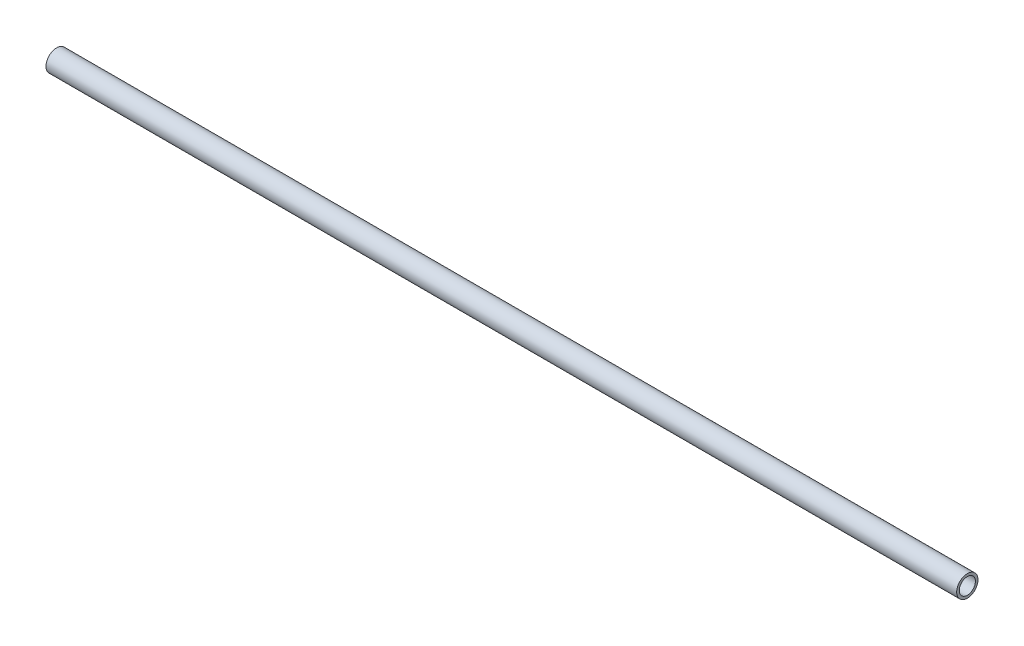
ISO-10303-21;
HEADER;
FILE_DESCRIPTION(('STEP AP214'),'2;1');
FILE_NAME('part.step','',(''),(''),'','','');
FILE_SCHEMA(('AUTOMOTIVE_DESIGN { 1 0 10303 214 1 1 1 1 }'));
ENDSEC;
DATA;
#1=APPLICATION_CONTEXT('core data for automotive mechanical design processes');
#2=APPLICATION_PROTOCOL_DEFINITION('international standard','automotive_design',2000,#1);
#3=PRODUCT_CONTEXT('',#1,'mechanical');
#4=PRODUCT('Part','Part','',(#3));
#5=PRODUCT_RELATED_PRODUCT_CATEGORY('part','',(#4));
#6=PRODUCT_DEFINITION_FORMATION('','',#4);
#7=PRODUCT_DEFINITION_CONTEXT('part definition',#1,'design');
#8=PRODUCT_DEFINITION('design','',#6,#7);
#9=PRODUCT_DEFINITION_SHAPE('','',#8);
#10=(LENGTH_UNIT() NAMED_UNIT(*) SI_UNIT(.MILLI.,.METRE.));
#11=(NAMED_UNIT(*) PLANE_ANGLE_UNIT() SI_UNIT($,.RADIAN.));
#12=(NAMED_UNIT(*) SI_UNIT($,.STERADIAN.) SOLID_ANGLE_UNIT());
#13=UNCERTAINTY_MEASURE_WITH_UNIT(LENGTH_MEASURE(1.E-05),#10,'distance_accuracy_value','');
#14=(GEOMETRIC_REPRESENTATION_CONTEXT(3) GLOBAL_UNCERTAINTY_ASSIGNED_CONTEXT((#13)) GLOBAL_UNIT_ASSIGNED_CONTEXT((#10,
#11,#12)) REPRESENTATION_CONTEXT('',''));
#15=CARTESIAN_POINT('',(0.,0.,0.));
#16=DIRECTION('',(0.,0.,1.));
#17=DIRECTION('',(1.,0.,0.));
#18=AXIS2_PLACEMENT_3D('',#15,#16,#17);
#19=CARTESIAN_POINT('',(90.,0.,0.));
#20=DIRECTION('',(1.,0.,0.));
#21=DIRECTION('',(0.,0.,-1.));
#22=AXIS2_PLACEMENT_3D('',#19,#20,#21);
#23=PLANE('',#22);
#24=CARTESIAN_POINT('',(90.,0.,0.));
#25=DIRECTION('',(1.,0.,0.));
#26=DIRECTION('',(0.,0.,-1.));
#27=AXIS2_PLACEMENT_3D('',#24,#25,#26);
#28=CIRCLE('',#27,1.0541);
#29=CARTESIAN_POINT('',(90.,0.,-1.0541));
#30=VERTEX_POINT('',#29);
#31=EDGE_CURVE('E146',#30,#30,#28,.T.);
#32=ORIENTED_EDGE('',*,*,#31,.T.);
#33=EDGE_LOOP('',(#32));
#34=FACE_BOUND('',#33,.T.);
#35=CARTESIAN_POINT('',(90.,0.,0.));
#36=DIRECTION('',(1.,0.,0.));
#37=DIRECTION('',(0.,0.,-1.));
#38=AXIS2_PLACEMENT_3D('',#35,#36,#37);
#39=CIRCLE('',#38,0.8001);
#40=CARTESIAN_POINT('',(90.,0.,-0.8001));
#41=VERTEX_POINT('',#40);
#42=EDGE_CURVE('E100',#41,#41,#39,.T.);
#43=ORIENTED_EDGE('',*,*,#42,.F.);
#44=EDGE_LOOP('',(#43));
#45=FACE_BOUND('',#44,.T.);
#46=ADVANCED_FACE('F35',(#34,#45),#23,.T.);
#47=CARTESIAN_POINT('',(0.,0.,0.));
#48=DIRECTION('',(1.,0.,0.));
#49=DIRECTION('',(0.,0.,-1.));
#50=AXIS2_PLACEMENT_3D('',#47,#48,#49);
#51=PLANE('',#50);
#52=CARTESIAN_POINT('',(0.,0.,0.));
#53=DIRECTION('',(1.,0.,0.));
#54=DIRECTION('',(0.,0.,-1.));
#55=AXIS2_PLACEMENT_3D('',#52,#53,#54);
#56=CIRCLE('',#55,1.0541);
#57=CARTESIAN_POINT('',(0.,0.,-1.0541));
#58=VERTEX_POINT('',#57);
#59=EDGE_CURVE('E148',#58,#58,#56,.T.);
#60=ORIENTED_EDGE('',*,*,#59,.F.);
#61=EDGE_LOOP('',(#60));
#62=FACE_BOUND('',#61,.T.);
#63=CARTESIAN_POINT('',(0.,0.,0.));
#64=DIRECTION('',(1.,0.,0.));
#65=DIRECTION('',(0.,0.,-1.));
#66=AXIS2_PLACEMENT_3D('',#63,#64,#65);
#67=CIRCLE('',#66,0.8001);
#68=CARTESIAN_POINT('',(0.,0.,-0.8001));
#69=VERTEX_POINT('',#68);
#70=EDGE_CURVE('E97',#69,#69,#67,.T.);
#71=ORIENTED_EDGE('',*,*,#70,.T.);
#72=EDGE_LOOP('',(#71));
#73=FACE_BOUND('',#72,.T.);
#74=ADVANCED_FACE('F160',(#62,#73),#51,.F.);
#75=CARTESIAN_POINT('',(90.,0.,0.));
#76=DIRECTION('',(-1.,0.,0.));
#77=DIRECTION('',(0.,0.,1.));
#78=AXIS2_PLACEMENT_3D('',#75,#76,#77);
#79=CYLINDRICAL_SURFACE('',#78,1.0541);
#80=DIRECTION('',(-1.,0.,0.));
#81=VECTOR('',#80,1.);
#82=CARTESIAN_POINT('',(90.,0.79375,-0.693604892932569));
#83=LINE('',#82,#81);
#84=CARTESIAN_POINT('',(4.22965786459374,0.79375,-0.693604892932567));
#85=VERTEX_POINT('',#84);
#86=CARTESIAN_POINT('',(1.07965786459374,0.79375,-0.693604892932569));
#87=VERTEX_POINT('',#86);
#88=EDGE_CURVE('E96',#85,#87,#83,.T.);
#89=ORIENTED_EDGE('',*,*,#88,.T.);
#90=CARTESIAN_POINT('',(1.07965786459374,0.79375,-0.693604892932567));
#91=CARTESIAN_POINT('',(1.06097650076287,0.793754302158675,-0.69359247993803));
#92=CARTESIAN_POINT('',(1.04231223508289,0.793090191085494,-0.69436031470599));
#93=CARTESIAN_POINT('',(1.005229850283,0.790470009943291,-0.697345228610568));
#94=CARTESIAN_POINT('',(0.986811293598215,0.788516678857944,-0.699559235212214));
#95=CARTESIAN_POINT('',(0.932622122592786,0.780856247540208,-0.708130425039182));
#96=CARTESIAN_POINT('',(0.897397203167143,0.773345984622935,-0.716422927180524));
#97=CARTESIAN_POINT('',(0.829603768208356,0.754155298401055,-0.736590197362163));
#98=CARTESIAN_POINT('',(0.797016823312525,0.742507559504099,-0.748436778719499));
#99=CARTESIAN_POINT('',(0.734239036964473,0.715469484959063,-0.774327217608681));
#100=CARTESIAN_POINT('',(0.704057751250156,0.700065123297631,-0.788379237773462));
#101=CARTESIAN_POINT('',(0.640174312285661,0.662228942353192,-0.820559528642505));
#102=CARTESIAN_POINT('',(0.607063395270207,0.639000712266537,-0.838924192889501));
#103=CARTESIAN_POINT('',(0.544695968844711,0.587778167834582,-0.875578890317217));
#104=CARTESIAN_POINT('',(0.515441644617538,0.559781171875426,-0.893868875545558));
#105=CARTESIAN_POINT('',(0.455527874305952,0.492863450316194,-0.932739772433391));
#106=CARTESIAN_POINT('',(0.425832185773999,0.452881224721931,-0.953010656015409));
#107=CARTESIAN_POINT('',(0.373887659986069,0.36666459507562,-0.989372403012117));
#108=CARTESIAN_POINT('',(0.351622469417229,0.320444239479246,-1.00547242808366));
#109=CARTESIAN_POINT('',(0.321524663051466,0.237860657499026,-1.02751382523747));
#110=CARTESIAN_POINT('',(0.311362500794273,0.202766377829282,-1.03505540472533));
#111=CARTESIAN_POINT('',(0.295926994558195,0.130956300347958,-1.04656329756168));
#112=CARTESIAN_POINT('',(0.29064928151658,0.0942419824980385,-1.05053280598323));
#113=CARTESIAN_POINT('',(0.285291062863292,0.0201199452583417,-1.05456305863377));
#114=CARTESIAN_POINT('',(0.285224336828193,-0.0172893509458742,-1.05461343938904));
#115=CARTESIAN_POINT('',(0.29032655497621,-0.0915462594727918,-1.05077537273126));
#116=CARTESIAN_POINT('',(0.295496690386011,-0.12839374206428,-1.04688602915075));
#117=CARTESIAN_POINT('',(0.31048570658938,-0.199193420608315,-1.03570739670066));
#118=CARTESIAN_POINT('',(0.320135685550259,-0.233201804717662,-1.02854176946564));
#119=CARTESIAN_POINT('',(0.343547137371748,-0.298999717571231,-1.01137704762977));
#120=CARTESIAN_POINT('',(0.357309575166656,-0.33078872340566,-1.00137728806549));
#121=CARTESIAN_POINT('',(0.390121038311679,-0.394987028174313,-0.977958224162252));
#122=CARTESIAN_POINT('',(0.409580401573969,-0.42709277051222,-0.964286294346073));
#123=CARTESIAN_POINT('',(0.452321179626761,-0.487714740168385,-0.935091093581731));
#124=CARTESIAN_POINT('',(0.475605424727434,-0.516228281536763,-0.919566454022395));
#125=CARTESIAN_POINT('',(0.530480061376216,-0.574766104604717,-0.884394621527938));
#126=CARTESIAN_POINT('',(0.562802860506998,-0.603978472312668,-0.86453838675115));
#127=CARTESIAN_POINT('',(0.631919569617189,-0.656860939575049,-0.825074353856983));
#128=CARTESIAN_POINT('',(0.66871835348482,-0.680524913942816,-0.805466852699236));
#129=CARTESIAN_POINT('',(0.739124028536789,-0.717873076438503,-0.77219536215681));
#130=CARTESIAN_POINT('',(0.771977428896138,-0.73260181211822,-0.758114459117832));
#131=CARTESIAN_POINT('',(0.840304246182429,-0.757669993472431,-0.733058635643747));
#132=CARTESIAN_POINT('',(0.875763480459972,-0.76803139271991,-0.722068274983034));
#133=CARTESIAN_POINT('',(0.939233432262899,-0.781711212737481,-0.707200978829105));
#134=CARTESIAN_POINT('',(0.966731288222226,-0.786167926359881,-0.702211171973755));
#135=CARTESIAN_POINT('',(1.02267311520765,-0.792213098542312,-0.695365423499634));
#136=CARTESIAN_POINT('',(1.05112348542466,-0.793774641637027,-0.69353890011247));
#137=CARTESIAN_POINT('',(1.07965786459374,-0.79375,-0.693604892932569));
#138=B_SPLINE_CURVE_WITH_KNOTS('',3,(#90,#91,#92,#93,#94,#95,#96,#97,#98,#99,#100,#101,#102,
#103,#104,#105,#106,#107,#108,#109,#110,#111,#112,#113,#114,#115,#116,#117,#118,#119,#120,#121,
#122,#123,#124,#125,#126,#127,#128,#129,#130,#131,#132,#133,#134,#135,#136,#137),.UNSPECIFIED.,
.F.,.F.,(4,2,2,2,2,2,2,2,2,2,2,2,2,2,2,2,2,2,2,2,2,2,2,4),(0.,0.0559864271356696,
0.111854290785416,0.222056996215594,0.3314078268173,0.441173362821062,0.573985149398091,
0.70687186791338,0.867279777259277,1.02733229030916,1.13878139857255,1.25013072074415,
1.36177447748187,1.47344363548265,1.58120744123691,1.68899655222985,1.80842276695392,
1.92793775529119,2.07103339640152,2.2142862728535,2.32990685286528,2.44493909647904,
2.52952236565082,2.61488810970727),.UNSPECIFIED.);
#139=CARTESIAN_POINT('',(1.07965786459374,-0.79375,-0.693604892932569));
#140=VERTEX_POINT('',#139);
#141=EDGE_CURVE('E89',#87,#140,#138,.T.);
#142=ORIENTED_EDGE('',*,*,#141,.T.);
#143=DIRECTION('',(-1.,0.,0.));
#144=VECTOR('',#143,1.);
#145=CARTESIAN_POINT('',(90.,-0.79375,-0.693604892932569));
#146=LINE('',#145,#144);
#147=CARTESIAN_POINT('',(4.22965786459374,-0.79375,-0.693604892932569));
#148=VERTEX_POINT('',#147);
#149=EDGE_CURVE('E78',#140,#148,#146,.F.);
#150=ORIENTED_EDGE('',*,*,#149,.T.);
#151=CARTESIAN_POINT('',(4.22965786459374,-0.79375,-0.693604892932567));
#152=CARTESIAN_POINT('',(4.24833922842462,-0.793754302158675,-0.69359247993803));
#153=CARTESIAN_POINT('',(4.2670034941046,-0.793090191085493,-0.69436031470599));
#154=CARTESIAN_POINT('',(4.30408587890448,-0.790470009943291,-0.697345228610568));
#155=CARTESIAN_POINT('',(4.32250443558927,-0.788516678857944,-0.699559235212214));
#156=CARTESIAN_POINT('',(4.3766936065947,-0.780856247540207,-0.708130425039183));
#157=CARTESIAN_POINT('',(4.41191852602035,-0.773345984622933,-0.716422927180526));
#158=CARTESIAN_POINT('',(4.47971196097914,-0.754155298401051,-0.736590197362166));
#159=CARTESIAN_POINT('',(4.51229890587497,-0.742507559504094,-0.748436778719503));
#160=CARTESIAN_POINT('',(4.57507669222303,-0.715469484959056,-0.774327217608688));
#161=CARTESIAN_POINT('',(4.60525797793734,-0.700065123297623,-0.78837923777347));
#162=CARTESIAN_POINT('',(4.66914141690184,-0.662228942353179,-0.820559528642515));
#163=CARTESIAN_POINT('',(4.7022523339173,-0.639000712266521,-0.838924192889513));
#164=CARTESIAN_POINT('',(4.7646197603428,-0.587778167834558,-0.875578890317233));
#165=CARTESIAN_POINT('',(4.79387408456997,-0.559781171875399,-0.893868875545576));
#166=CARTESIAN_POINT('',(4.85378785488156,-0.492863450316159,-0.93273977243341));
#167=CARTESIAN_POINT('',(4.88348354341351,-0.452881224721892,-0.953010656015428));
#168=CARTESIAN_POINT('',(4.93542806920144,-0.366664595075573,-0.989372403012134));
#169=CARTESIAN_POINT('',(4.95769325977028,-0.320444239479195,-1.00547242808368));
#170=CARTESIAN_POINT('',(4.98779106613603,-0.237860657498972,-1.02751382523749));
#171=CARTESIAN_POINT('',(4.99795322839323,-0.202766377829228,-1.03505540472534));
#172=CARTESIAN_POINT('',(5.0133887346293,-0.130956300347906,-1.04656329756169));
#173=CARTESIAN_POINT('',(5.01866644767091,-0.0942419824979876,-1.05053280598323));
#174=CARTESIAN_POINT('',(5.02402466632419,-0.0201199452582937,-1.05456305863377));
#175=CARTESIAN_POINT('',(5.02409139235929,0.0172893509459204,-1.05461343938904));
#176=CARTESIAN_POINT('',(5.01898917421127,0.091546259472834,-1.05077537273125));
#177=CARTESIAN_POINT('',(5.01381903880147,0.12839374206432,-1.04688602915074));
#178=CARTESIAN_POINT('',(4.99883002259809,0.199193420608351,-1.03570739670066));
#179=CARTESIAN_POINT('',(4.98918004363721,0.233201804717696,-1.02854176946564));
#180=CARTESIAN_POINT('',(4.96576859181572,0.298999717571263,-1.01137704762976));
#181=CARTESIAN_POINT('',(4.95200615402081,0.33078872340569,-1.00137728806548));
#182=CARTESIAN_POINT('',(4.91919469087579,0.394987028174341,-0.977958224162241));
#183=CARTESIAN_POINT('',(4.8997353276135,0.427092770512248,-0.964286294346061));
#184=CARTESIAN_POINT('',(4.8569945495607,0.487714740168411,-0.935091093581717));
#185=CARTESIAN_POINT('',(4.83371030446003,0.516228281536788,-0.919566454022381));
#186=CARTESIAN_POINT('',(4.77883566781124,0.574766104604741,-0.884394621527923));
#187=CARTESIAN_POINT('',(4.74651286868046,0.603978472312691,-0.864538386751134));
#188=CARTESIAN_POINT('',(4.67739615957026,0.65686093957507,-0.825074353856966));
#189=CARTESIAN_POINT('',(4.64059737570263,0.680524913942836,-0.805466852699219));
#190=CARTESIAN_POINT('',(4.57019170065066,0.71787307643852,-0.772195362156795));
#191=CARTESIAN_POINT('',(4.53733830029131,0.732601812118235,-0.758114459117817));
#192=CARTESIAN_POINT('',(4.46901148300502,0.757669993472442,-0.733058635643735));
#193=CARTESIAN_POINT('',(4.43355224872748,0.768031392719919,-0.722068274983024));
#194=CARTESIAN_POINT('',(4.37008229692455,0.781711212737486,-0.707200978829099));
#195=CARTESIAN_POINT('',(4.34258444096523,0.786167926359885,-0.702211171973751));
#196=CARTESIAN_POINT('',(4.28664261397982,0.792213098542313,-0.695365423499633));
#197=CARTESIAN_POINT('',(4.25819224376282,0.793774641637027,-0.693538900112469));
#198=CARTESIAN_POINT('',(4.22965786459374,0.79375,-0.693604892932569));
#199=B_SPLINE_CURVE_WITH_KNOTS('',3,(#151,#152,#153,#154,#155,#156,#157,#158,#159,#160,#161,
#162,#163,#164,#165,#166,#167,#168,#169,#170,#171,#172,#173,#174,#175,#176,#177,#178,#179,#180,
#181,#182,#183,#184,#185,#186,#187,#188,#189,#190,#191,#192,#193,#194,#195,#196,#197,#198),
.UNSPECIFIED.,.F.,.F.,(4,2,2,2,2,2,2,2,2,2,2,2,2,2,2,2,2,2,2,2,2,2,2,4),(0.,0.0559864271356725,
0.111854290785421,0.222056996215604,0.331407826817316,0.441173362821084,0.573985149398126,
0.706871867913427,0.86727977725933,1.02733229030922,1.1387813985726,1.2501307207442,
1.36177447748191,1.47344363548269,1.58120744123694,1.68899655222988,1.80842276695395,
1.92793775529123,2.07103339640156,2.21428627285354,2.32990685286532,2.44493909647907,
2.52952236565084,2.61488810970727),.UNSPECIFIED.);
#200=EDGE_CURVE('E83',#148,#85,#199,.T.);
#201=ORIENTED_EDGE('',*,*,#200,.T.);
#202=EDGE_LOOP('',(#89,#142,#150,#201));
#203=FACE_BOUND('',#202,.T.);
#204=ORIENTED_EDGE('',*,*,#31,.F.);
#205=EDGE_LOOP('',(#204));
#206=FACE_BOUND('',#205,.T.);
#207=ORIENTED_EDGE('',*,*,#59,.T.);
#208=EDGE_LOOP('',(#207));
#209=FACE_BOUND('',#208,.T.);
#210=ADVANCED_FACE('F37',(#203,#206,#209),#79,.T.);
#211=CARTESIAN_POINT('',(90.,0.,0.));
#212=DIRECTION('',(-1.,0.,0.));
#213=DIRECTION('',(0.,0.,1.));
#214=AXIS2_PLACEMENT_3D('',#211,#212,#213);
#215=CYLINDRICAL_SURFACE('',#214,0.8001);
#216=CARTESIAN_POINT('',(1.07965786459374,0.79375,-0.100602919937742));
#217=CARTESIAN_POINT('',(1.07260009999338,0.793752580415863,-0.100562752228033));
#218=CARTESIAN_POINT('',(1.0656131964436,0.793656269322355,-0.101344373984846));
#219=CARTESIAN_POINT('',(1.0520534160492,0.79329731920655,-0.104126543732192));
#220=CARTESIAN_POINT('',(1.04547463984961,0.793038700041046,-0.106097589311742));
#221=CARTESIAN_POINT('',(1.02512651207065,0.79199948542371,-0.113672782754282));
#222=CARTESIAN_POINT('',(1.01199096055756,0.790962622917239,-0.120824562683411));
#223=CARTESIAN_POINT('',(0.986526735979871,0.788372762566756,-0.136740865129245));
#224=CARTESIAN_POINT('',(0.974222029252654,0.786808960093339,-0.145537272654652));
#225=CARTESIAN_POINT('',(0.936175655293873,0.781119807854132,-0.174383438233588));
#226=CARTESIAN_POINT('',(0.911460790978969,0.77613131074895,-0.195616409962328));
#227=CARTESIAN_POINT('',(0.863034471248664,0.764021091266688,-0.238630839757729));
#228=CARTESIAN_POINT('',(0.839325241722288,0.756894892542658,-0.260413360045415));
#229=CARTESIAN_POINT('',(0.7928104913249,0.740515375406274,-0.303858368517974));
#230=CARTESIAN_POINT('',(0.770000277505968,0.731275523925843,-0.32552076325258));
#231=CARTESIAN_POINT('',(0.725109410776731,0.710593606059413,-0.368491808730466));
#232=CARTESIAN_POINT('',(0.70302816403573,0.699153386732922,-0.38980073999955));
#233=CARTESIAN_POINT('',(0.637631919707409,0.661218594342199,-0.453198381357721));
#234=CARTESIAN_POINT('',(0.595471116939003,0.631215250936409,-0.494465780416442));
#235=CARTESIAN_POINT('',(0.515755332413795,0.561120754372067,-0.5727618946995));
#236=CARTESIAN_POINT('',(0.478192542241739,0.521047066440065,-0.609797788597676));
#237=CARTESIAN_POINT('',(0.423432462299081,0.447897062977243,-0.663884104597088));
#238=CARTESIAN_POINT('',(0.403981807623953,0.418121016511048,-0.6831197407648));
#239=CARTESIAN_POINT('',(0.368627581117735,0.354667305397305,-0.718107672790183));
#240=CARTESIAN_POINT('',(0.352718640237664,0.320995665669055,-0.733865240899397));
#241=CARTESIAN_POINT('',(0.327475183909554,0.255534879614495,-0.75887898317842));
#242=CARTESIAN_POINT('',(0.317510634572041,0.224229389667027,-0.768757614386306));
#243=CARTESIAN_POINT('',(0.301431171790593,0.159703456615445,-0.784701626280686));
#244=CARTESIAN_POINT('',(0.295314149157752,0.126484073617363,-0.790769096218304));
#245=CARTESIAN_POINT('',(0.287360562893429,0.0588787269369839,-0.798658689770376));
#246=CARTESIAN_POINT('',(0.28554283175774,0.0244882976477747,-0.800462135360367));
#247=CARTESIAN_POINT('',(0.28639502387974,-0.0441793263731721,-0.799616707520222));
#248=CARTESIAN_POINT('',(0.289064571630048,-0.0784565303394007,-0.796968206640758));
#249=CARTESIAN_POINT('',(0.298322670426837,-0.143360422925039,-0.787785072442504));
#250=CARTESIAN_POINT('',(0.304616177325643,-0.174072541596123,-0.781543015496891));
#251=CARTESIAN_POINT('',(0.320480174121004,-0.23375971866553,-0.765813727172332));
#252=CARTESIAN_POINT('',(0.330052118288487,-0.262733999468163,-0.756325055640473));
#253=CARTESIAN_POINT('',(0.355761949879318,-0.328074133554567,-0.730850332898736));
#254=CARTESIAN_POINT('',(0.373025825621833,-0.363563740422262,-0.713752016258492));
#255=CARTESIAN_POINT('',(0.411427054393516,-0.430103956767309,-0.6757556823063));
#256=CARTESIAN_POINT('',(0.432569924479873,-0.4611481301282,-0.654852253353879));
#257=CARTESIAN_POINT('',(0.485992897783563,-0.529238313476643,-0.602108130385278));
#258=CARTESIAN_POINT('',(0.519527727551753,-0.564364044051201,-0.569053760331396));
#259=CARTESIAN_POINT('',(0.572567631693679,-0.611112128085866,-0.516962733886401));
#260=CARTESIAN_POINT('',(0.590751606888933,-0.625733086887052,-0.49913423083148));
#261=CARTESIAN_POINT('',(0.627884617383977,-0.65304692543149,-0.462823003530886));
#262=CARTESIAN_POINT('',(0.646833224499566,-0.66574086582363,-0.444340646131228));
#263=CARTESIAN_POINT('',(0.691230714040923,-0.692842684826605,-0.401198034678774));
#264=CARTESIAN_POINT('',(0.716907407303812,-0.70660192687858,-0.376364861437129));
#265=CARTESIAN_POINT('',(0.769293383491798,-0.73112980438965,-0.326178746315637));
#266=CARTESIAN_POINT('',(0.796005206667303,-0.741890472069134,-0.3008246082839));
#267=CARTESIAN_POINT('',(0.850289361859094,-0.760429566579298,-0.250242215568819));
#268=CARTESIAN_POINT('',(0.877856140385093,-0.768224101621745,-0.22501403717036));
#269=CARTESIAN_POINT('',(0.920449584203122,-0.777753320963775,-0.188206910895324));
#270=CARTESIAN_POINT('',(0.9348207719926,-0.780565367231234,-0.176136487765467));
#271=CARTESIAN_POINT('',(0.964296839426871,-0.785465659823442,-0.152781253497166));
#272=CARTESIAN_POINT('',(0.979399880201927,-0.787555622850149,-0.141494630739641));
#273=CARTESIAN_POINT('',(1.00278810273053,-0.790054714995639,-0.126484948419215));
#274=CARTESIAN_POINT('',(1.01047922061719,-0.790769628259772,-0.12190695682303));
#275=CARTESIAN_POINT('',(1.02627870190088,-0.791992462553468,-0.113686370551512));
#276=CARTESIAN_POINT('',(1.03438141157852,-0.792502617332124,-0.110033851389558));
#277=CARTESIAN_POINT('',(1.04863481877004,-0.793164902784871,-0.105138056178755));
#278=CARTESIAN_POINT('',(1.05463996231439,-0.793378560634889,-0.10350059254709));
#279=CARTESIAN_POINT('',(1.06696488007649,-0.793673483690896,-0.101208528467252));
#280=CARTESIAN_POINT('',(1.07328863941051,-0.793751812580565,-0.100575750367154));
#281=CARTESIAN_POINT('',(1.07965786459375,-0.793750000000001,-0.100602919937775));
#282=B_SPLINE_CURVE_WITH_KNOTS('',3,(#216,#217,#218,#219,#220,#221,#222,#223,#224,#225,#226,
#227,#228,#229,#230,#231,#232,#233,#234,#235,#236,#237,#238,#239,#240,#241,#242,#243,#244,#245,
#246,#247,#248,#249,#250,#251,#252,#253,#254,#255,#256,#257,#258,#259,#260,#261,#262,#263,#264,
#265,#266,#267,#268,#269,#270,#271,#272,#273,#274,#275,#276,#277,#278,#279,#280,#281),
.UNSPECIFIED.,.F.,.F.,(4,2,2,2,2,2,2,2,2,2,2,2,2,2,2,2,2,2,2,2,2,2,2,2,2,2,2,2,2,2,2,2,4),(0.,
0.0210183429681526,0.0415356257350441,0.0861604757002492,0.131762472906189,0.230432679498222,
0.329310961145965,0.42757598059926,0.525758870429254,0.723421466360158,0.920743589358996,
1.04164903818636,1.16236993347871,1.26485955792896,1.36729294915946,1.47017421240548,
1.57304686670351,1.66853571408115,1.76406697401092,1.892386568983,2.02089010685359,
2.19610476258023,2.28414267478119,2.37213195301882,2.48681935849935,2.60180866567349,
2.71616427095236,2.77308560425218,2.82987066456287,2.85677671440048,2.88338069580867,
2.90198601642329,2.92099018321528),.UNSPECIFIED.);
#283=CARTESIAN_POINT('',(1.07965786459374,0.79375,-0.100602919937744));
#284=VERTEX_POINT('',#283);
#285=CARTESIAN_POINT('',(1.07965786459374,-0.79375,-0.100602919937744));
#286=VERTEX_POINT('',#285);
#287=EDGE_CURVE('E11',#284,#286,#282,.T.);
#288=ORIENTED_EDGE('',*,*,#287,.F.);
#289=DIRECTION('',(-1.,0.,0.));
#290=VECTOR('',#289,1.);
#291=CARTESIAN_POINT('',(90.,0.79375,-0.100602919937744));
#292=LINE('',#291,#290);
#293=CARTESIAN_POINT('',(4.22965786459374,0.79375,-0.100602919937742));
#294=VERTEX_POINT('',#293);
#295=EDGE_CURVE('E49',#294,#284,#292,.T.);
#296=ORIENTED_EDGE('',*,*,#295,.F.);
#297=CARTESIAN_POINT('',(4.22965786459374,-0.79375,-0.100602919937742));
#298=CARTESIAN_POINT('',(4.23671562919411,-0.793752580415863,-0.100562752228033));
#299=CARTESIAN_POINT('',(4.24370253274389,-0.793656269322354,-0.101344373984848));
#300=CARTESIAN_POINT('',(4.2572623131383,-0.79329731920655,-0.104126543732197));
#301=CARTESIAN_POINT('',(4.2638410893379,-0.793038700041045,-0.106097589311749));
#302=CARTESIAN_POINT('',(4.28418921711688,-0.791999485423707,-0.113672782754303));
#303=CARTESIAN_POINT('',(4.29732476863,-0.790962622917233,-0.12082456268345));
#304=CARTESIAN_POINT('',(4.32278899320773,-0.788372762566743,-0.136740865129322));
#305=CARTESIAN_POINT('',(4.33509369993496,-0.786808960093322,-0.145537272654749));
#306=CARTESIAN_POINT('',(4.37314007389381,-0.781119807854097,-0.174383438233753));
#307=CARTESIAN_POINT('',(4.39785493820876,-0.776131310748898,-0.195616409962542));
#308=CARTESIAN_POINT('',(4.44628125793916,-0.764021091266593,-0.238630839758039));
#309=CARTESIAN_POINT('',(4.46999048746558,-0.756894892542537,-0.260413360045772));
#310=CARTESIAN_POINT('',(4.51650523786306,-0.740515375406092,-0.303858368518422));
#311=CARTESIAN_POINT('',(4.53931545168203,-0.731275523925625,-0.325520763253072));
#312=CARTESIAN_POINT('',(4.58420631841135,-0.710593606059116,-0.368491808731043));
#313=CARTESIAN_POINT('',(4.60628756515239,-0.699153386732579,-0.389800740000167));
#314=CARTESIAN_POINT('',(4.67168380948083,-0.661218594341702,-0.453198381358459));
#315=CARTESIAN_POINT('',(4.71384461224931,-0.631215250935784,-0.494465780417254));
#316=CARTESIAN_POINT('',(4.79356039677462,-0.561120754371138,-0.572761894700423));
#317=CARTESIAN_POINT('',(4.83112318694672,-0.521047066438959,-0.609797788598637));
#318=CARTESIAN_POINT('',(4.8858832668893,-0.447897062975921,-0.663884104597978));
#319=CARTESIAN_POINT('',(4.90533392156435,-0.418121016509718,-0.683119740765612));
#320=CARTESIAN_POINT('',(4.94068814807041,-0.354667305395977,-0.718107672790837));
#321=CARTESIAN_POINT('',(4.9565970889504,-0.320995665667736,-0.733865240899972));
#322=CARTESIAN_POINT('',(4.98184054527837,-0.255534879613187,-0.758878983178859));
#323=CARTESIAN_POINT('',(4.99180509461583,-0.224229389665717,-0.768757614386687));
#324=CARTESIAN_POINT('',(5.00788455739716,-0.159703456614145,-0.78470162628095));
#325=CARTESIAN_POINT('',(5.01400158002994,-0.126484073616075,-0.790769096218509));
#326=CARTESIAN_POINT('',(5.02195516629415,-0.0588787269357361,-0.798658689770467));
#327=CARTESIAN_POINT('',(5.02377289742978,-0.0244882976465557,-0.800462135360403));
#328=CARTESIAN_POINT('',(5.02292070530768,0.0441793263743203,-0.799616707520157));
#329=CARTESIAN_POINT('',(5.02025115755732,0.0784565303405072,-0.796968206640648));
#330=CARTESIAN_POINT('',(5.01099305876045,0.143360422926087,-0.787785072442313));
#331=CARTESIAN_POINT('',(5.00469955186161,0.174072541597153,-0.781543015496661));
#332=CARTESIAN_POINT('',(4.98883555506617,0.233759718666519,-0.76581372717203));
#333=CARTESIAN_POINT('',(4.97926361089866,0.262733999469129,-0.756325055640137));
#334=CARTESIAN_POINT('',(4.95355377930773,0.328074133555524,-0.730850332898308));
#335=CARTESIAN_POINT('',(4.93628990356516,0.363563740423227,-0.713752016258002));
#336=CARTESIAN_POINT('',(4.89788867479335,0.430103956768275,-0.675755682305687));
#337=CARTESIAN_POINT('',(4.87674580470693,0.46114813012916,-0.654852253353205));
#338=CARTESIAN_POINT('',(4.82332283140309,0.529238313477583,-0.602108130384457));
#339=CARTESIAN_POINT('',(4.78978800163481,0.564364044052121,-0.569053760330487));
#340=CARTESIAN_POINT('',(4.73674809749275,0.611112128086746,-0.516962733885363));
#341=CARTESIAN_POINT('',(4.71856412229745,0.625733086887917,-0.499134230830397));
#342=CARTESIAN_POINT('',(4.68143111180231,0.653046925432321,-0.462823003529716));
#343=CARTESIAN_POINT('',(4.66248250468667,0.665740865824441,-0.444340646130014));
#344=CARTESIAN_POINT('',(4.61808501514526,0.692842684827335,-0.401198034677511));
#345=CARTESIAN_POINT('',(4.59240832188236,0.706601926879253,-0.376364861435862));
#346=CARTESIAN_POINT('',(4.54002234569435,0.731129804390216,-0.326178746314367));
#347=CARTESIAN_POINT('',(4.51331052251883,0.741890472069648,-0.30082460828263));
#348=CARTESIAN_POINT('',(4.45902636732703,0.760429566579707,-0.250242215567572));
#349=CARTESIAN_POINT('',(4.43145958880103,0.768224101622102,-0.225014037169135));
#350=CARTESIAN_POINT('',(4.38886614498299,0.777753320964055,-0.188206910894163));
#351=CARTESIAN_POINT('',(4.37449495719351,0.78056536723149,-0.176136487764333));
#352=CARTESIAN_POINT('',(4.34501888975921,0.785465659823647,-0.152781253496106));
#353=CARTESIAN_POINT('',(4.32991584898414,0.787555622850329,-0.141494630738629));
#354=CARTESIAN_POINT('',(4.30652762645557,0.790054714995773,-0.126484948418372));
#355=CARTESIAN_POINT('',(4.29883650856896,0.790769628259888,-0.121906956822276));
#356=CARTESIAN_POINT('',(4.2830370272854,0.791992462553549,-0.113686370550945));
#357=CARTESIAN_POINT('',(4.27493431760781,0.792502617332189,-0.110033851389088));
#358=CARTESIAN_POINT('',(4.26068091041652,0.793164902784906,-0.10513805617849));
#359=CARTESIAN_POINT('',(4.25467576687234,0.793378560634912,-0.103500592546918));
#360=CARTESIAN_POINT('',(4.24235084911061,0.793673483690901,-0.101208528467214));
#361=CARTESIAN_POINT('',(4.23602708977677,0.793751812580565,-0.100575750367156));
#362=CARTESIAN_POINT('',(4.22965786459373,0.793750000000001,-0.100602919937775));
#363=B_SPLINE_CURVE_WITH_KNOTS('',3,(#297,#298,#299,#300,#301,#302,#303,#304,#305,#306,#307,
#308,#309,#310,#311,#312,#313,#314,#315,#316,#317,#318,#319,#320,#321,#322,#323,#324,#325,#326,
#327,#328,#329,#330,#331,#332,#333,#334,#335,#336,#337,#338,#339,#340,#341,#342,#343,#344,#345,
#346,#347,#348,#349,#350,#351,#352,#353,#354,#355,#356,#357,#358,#359,#360,#361,#362),
.UNSPECIFIED.,.F.,.F.,(4,2,2,2,2,2,2,2,2,2,2,2,2,2,2,2,2,2,2,2,2,2,2,2,2,2,2,2,2,2,2,2,4),(0.,
0.0210183429681665,0.0415356257350717,0.0861604757003577,0.131762472906383,0.230432679498624,
0.329310961146573,0.427575980600074,0.525758870430274,0.723421466361618,0.920743589360888,
1.04164903818804,1.16236993348018,1.26485955793033,1.36729294916074,1.47017421240666,
1.57304686670459,1.66853571408222,1.764066974012,1.89238656898424,2.020890106855,
2.1961047625819,2.28414267478301,2.37213195302078,2.48681935850127,2.6018086656754,
2.71616427095419,2.77308560425396,2.82987066456459,2.8567767144019,2.8833806958098,
2.90198601642387,2.92099018321528),.UNSPECIFIED.);
#364=CARTESIAN_POINT('',(4.22965786459374,-0.79375,-0.100602919937744));
#365=VERTEX_POINT('',#364);
#366=EDGE_CURVE('E121',#365,#294,#363,.T.);
#367=ORIENTED_EDGE('',*,*,#366,.F.);
#368=DIRECTION('',(-1.,0.,0.));
#369=VECTOR('',#368,1.);
#370=CARTESIAN_POINT('',(90.,-0.79375,-0.100602919937744));
#371=LINE('',#370,#369);
#372=EDGE_CURVE('E126',#286,#365,#371,.F.);
#373=ORIENTED_EDGE('',*,*,#372,.F.);
#374=EDGE_LOOP('',(#288,#296,#367,#373));
#375=FACE_BOUND('',#374,.T.);
#376=ORIENTED_EDGE('',*,*,#42,.T.);
#377=EDGE_LOOP('',(#376));
#378=FACE_BOUND('',#377,.T.);
#379=ORIENTED_EDGE('',*,*,#70,.F.);
#380=EDGE_LOOP('',(#379));
#381=FACE_BOUND('',#380,.T.);
#382=ADVANCED_FACE('F112',(#375,#378,#381),#215,.F.);
#383=CARTESIAN_POINT('',(1.07965786459374,0.,-10.));
#384=DIRECTION('',(0.,0.,1.));
#385=DIRECTION('',(1.,0.,0.));
#386=AXIS2_PLACEMENT_3D('',#383,#384,#385);
#387=CYLINDRICAL_SURFACE('',#386,0.79375);
#388=DIRECTION('',(0.,0.,1.));
#389=VECTOR('',#388,1.);
#390=CARTESIAN_POINT('',(1.07965786459374,0.79375,-10.));
#391=LINE('',#390,#389);
#392=EDGE_CURVE('E84',#87,#284,#391,.T.);
#393=ORIENTED_EDGE('',*,*,#392,.T.);
#394=ORIENTED_EDGE('',*,*,#287,.T.);
#395=DIRECTION('',(0.,0.,1.));
#396=VECTOR('',#395,1.);
#397=CARTESIAN_POINT('',(1.07965786459374,-0.79375,-10.));
#398=LINE('',#397,#396);
#399=EDGE_CURVE('E61',#140,#286,#398,.T.);
#400=ORIENTED_EDGE('',*,*,#399,.F.);
#401=ORIENTED_EDGE('',*,*,#141,.F.);
#402=EDGE_LOOP('',(#393,#394,#400,#401));
#403=FACE_BOUND('',#402,.T.);
#404=ADVANCED_FACE('F88',(#403),#387,.F.);
#405=CARTESIAN_POINT('',(1.07965786459374,0.79375,-10.));
#406=DIRECTION('',(0.,1.,0.));
#407=DIRECTION('',(0.,0.,1.));
#408=AXIS2_PLACEMENT_3D('',#405,#406,#407);
#409=PLANE('',#408);
#410=DIRECTION('',(0.,0.,1.));
#411=VECTOR('',#410,1.);
#412=CARTESIAN_POINT('',(4.22965786459374,0.79375,-10.));
#413=LINE('',#412,#411);
#414=EDGE_CURVE('E139',#85,#294,#413,.T.);
#415=ORIENTED_EDGE('',*,*,#414,.T.);
#416=ORIENTED_EDGE('',*,*,#295,.T.);
#417=ORIENTED_EDGE('',*,*,#392,.F.);
#418=ORIENTED_EDGE('',*,*,#88,.F.);
#419=EDGE_LOOP('',(#415,#416,#417,#418));
#420=FACE_BOUND('',#419,.T.);
#421=ADVANCED_FACE('F111',(#420),#409,.F.);
#422=CARTESIAN_POINT('',(4.22965786459374,0.,-10.));
#423=DIRECTION('',(0.,0.,1.));
#424=DIRECTION('',(1.,0.,0.));
#425=AXIS2_PLACEMENT_3D('',#422,#423,#424);
#426=CYLINDRICAL_SURFACE('',#425,0.79375);
#427=DIRECTION('',(0.,0.,1.));
#428=VECTOR('',#427,1.);
#429=CARTESIAN_POINT('',(4.22965786459374,-0.79375,-10.));
#430=LINE('',#429,#428);
#431=EDGE_CURVE('E56',#148,#365,#430,.T.);
#432=ORIENTED_EDGE('',*,*,#431,.T.);
#433=ORIENTED_EDGE('',*,*,#366,.T.);
#434=ORIENTED_EDGE('',*,*,#414,.F.);
#435=ORIENTED_EDGE('',*,*,#200,.F.);
#436=EDGE_LOOP('',(#432,#433,#434,#435));
#437=FACE_BOUND('',#436,.T.);
#438=ADVANCED_FACE('F128',(#437),#426,.F.);
#439=CARTESIAN_POINT('',(1.07965786459374,-0.79375,-10.));
#440=DIRECTION('',(0.,-1.,0.));
#441=DIRECTION('',(0.,0.,-1.));
#442=AXIS2_PLACEMENT_3D('',#439,#440,#441);
#443=PLANE('',#442);
#444=ORIENTED_EDGE('',*,*,#399,.T.);
#445=ORIENTED_EDGE('',*,*,#372,.T.);
#446=ORIENTED_EDGE('',*,*,#431,.F.);
#447=ORIENTED_EDGE('',*,*,#149,.F.);
#448=EDGE_LOOP('',(#444,#445,#446,#447));
#449=FACE_BOUND('',#448,.T.);
#450=ADVANCED_FACE('F79',(#449),#443,.F.);
#451=CLOSED_SHELL('',(#46,#74,#210,#382,#404,#421,#438,#450));
#452=MANIFOLD_SOLID_BREP('B2',#451);
#453=ADVANCED_BREP_SHAPE_REPRESENTATION('',(#18,#452),#14);
#454=SHAPE_DEFINITION_REPRESENTATION(#9,#453);
ENDSEC;
END-ISO-10303-21;
